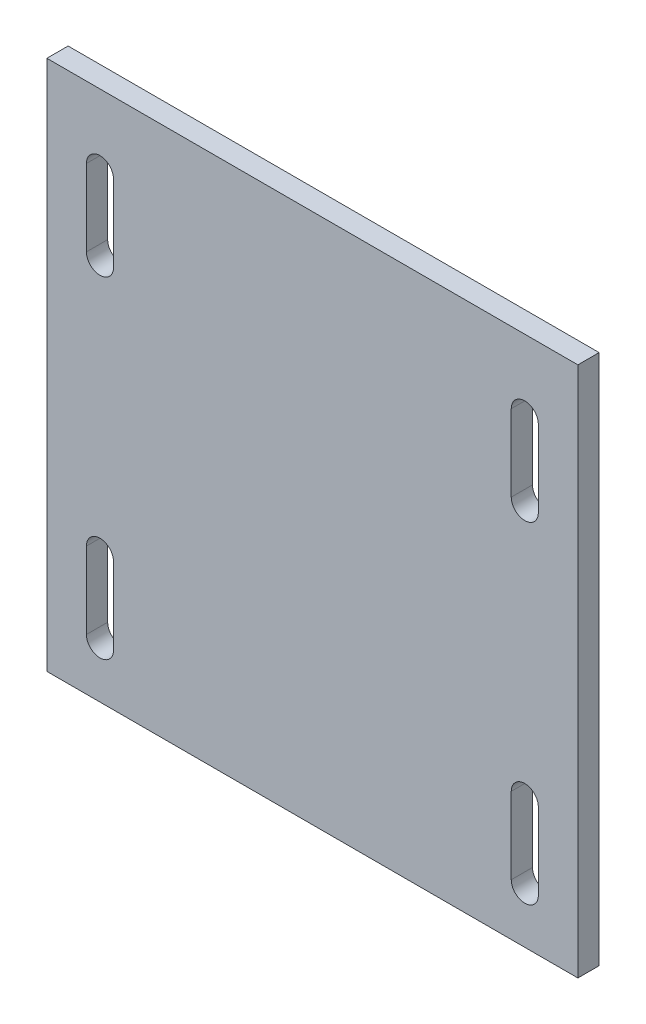
ISO-10303-21;
HEADER;
FILE_DESCRIPTION(('STEP AP214'),'2;1');
FILE_NAME('part.step','',(''),(''),'','','');
FILE_SCHEMA(('AUTOMOTIVE_DESIGN { 1 0 10303 214 1 1 1 1 }'));
ENDSEC;
DATA;
#1=APPLICATION_CONTEXT('core data for automotive mechanical design processes');
#2=APPLICATION_PROTOCOL_DEFINITION('international standard','automotive_design',2000,#1);
#3=PRODUCT_CONTEXT('',#1,'mechanical');
#4=PRODUCT('Part','Part','',(#3));
#5=PRODUCT_RELATED_PRODUCT_CATEGORY('part','',(#4));
#6=PRODUCT_DEFINITION_FORMATION('','',#4);
#7=PRODUCT_DEFINITION_CONTEXT('part definition',#1,'design');
#8=PRODUCT_DEFINITION('design','',#6,#7);
#9=PRODUCT_DEFINITION_SHAPE('','',#8);
#10=(LENGTH_UNIT() NAMED_UNIT(*) SI_UNIT(.MILLI.,.METRE.));
#11=(NAMED_UNIT(*) PLANE_ANGLE_UNIT() SI_UNIT($,.RADIAN.));
#12=(NAMED_UNIT(*) SI_UNIT($,.STERADIAN.) SOLID_ANGLE_UNIT());
#13=UNCERTAINTY_MEASURE_WITH_UNIT(LENGTH_MEASURE(1.E-05),#10,'distance_accuracy_value','');
#14=(GEOMETRIC_REPRESENTATION_CONTEXT(3) GLOBAL_UNCERTAINTY_ASSIGNED_CONTEXT((#13)) GLOBAL_UNIT_ASSIGNED_CONTEXT((#10,
#11,#12)) REPRESENTATION_CONTEXT('',''));
#15=CARTESIAN_POINT('',(0.,0.,0.));
#16=DIRECTION('',(0.,0.,1.));
#17=DIRECTION('',(1.,0.,0.));
#18=AXIS2_PLACEMENT_3D('',#15,#16,#17);
#19=CARTESIAN_POINT('',(0.,0.,4.));
#20=DIRECTION('',(0.,0.,1.));
#21=DIRECTION('',(1.,0.,0.));
#22=AXIS2_PLACEMENT_3D('',#19,#20,#21);
#23=PLANE('',#22);
#24=DIRECTION('',(0.,-1.,0.));
#25=VECTOR('',#24,1.);
#26=CARTESIAN_POINT('',(0.,0.,4.));
#27=LINE('',#26,#25);
#28=CARTESIAN_POINT('',(0.,90.,4.));
#29=VERTEX_POINT('',#28);
#30=CARTESIAN_POINT('',(0.,-10.,4.));
#31=VERTEX_POINT('',#30);
#32=EDGE_CURVE('E308',#29,#31,#27,.T.);
#33=ORIENTED_EDGE('',*,*,#32,.T.);
#34=DIRECTION('',(1.,0.,0.));
#35=VECTOR('',#34,1.);
#36=CARTESIAN_POINT('',(0.,-10.,4.));
#37=LINE('',#36,#35);
#38=CARTESIAN_POINT('',(100.,-10.,4.));
#39=VERTEX_POINT('',#38);
#40=EDGE_CURVE('E311',#31,#39,#37,.T.);
#41=ORIENTED_EDGE('',*,*,#40,.T.);
#42=DIRECTION('',(0.,1.,0.));
#43=VECTOR('',#42,1.);
#44=CARTESIAN_POINT('',(100.,-10.,4.));
#45=LINE('',#44,#43);
#46=CARTESIAN_POINT('',(100.,90.,4.));
#47=VERTEX_POINT('',#46);
#48=EDGE_CURVE('E314',#39,#47,#45,.T.);
#49=ORIENTED_EDGE('',*,*,#48,.T.);
#50=DIRECTION('',(-1.,0.,0.));
#51=VECTOR('',#50,1.);
#52=CARTESIAN_POINT('',(0.,90.,4.));
#53=LINE('',#52,#51);
#54=EDGE_CURVE('E316',#47,#29,#53,.T.);
#55=ORIENTED_EDGE('',*,*,#54,.T.);
#56=EDGE_LOOP('',(#33,#41,#49,#55));
#57=FACE_BOUND('',#56,.T.);
#58=DIRECTION('',(0.,-1.,0.));
#59=VECTOR('',#58,1.);
#60=CARTESIAN_POINT('',(7.45000000000001,14.1724377602917,4.));
#61=LINE('',#60,#59);
#62=CARTESIAN_POINT('',(7.45000000000001,14.1724377602917,4.));
#63=VERTEX_POINT('',#62);
#64=CARTESIAN_POINT('',(7.45000000000001,-0.250300489708305,4.));
#65=VERTEX_POINT('',#64);
#66=EDGE_CURVE('E279',#63,#65,#61,.T.);
#67=ORIENTED_EDGE('',*,*,#66,.F.);
#68=CARTESIAN_POINT('',(10.,14.1724377602917,4.));
#69=DIRECTION('',(0.,0.,1.));
#70=DIRECTION('',(-1.,0.,0.));
#71=AXIS2_PLACEMENT_3D('',#68,#69,#70);
#72=CIRCLE('',#71,2.55);
#73=CARTESIAN_POINT('',(12.55,14.1724377602917,4.));
#74=VERTEX_POINT('',#73);
#75=EDGE_CURVE('E277',#74,#63,#72,.T.);
#76=ORIENTED_EDGE('',*,*,#75,.F.);
#77=DIRECTION('',(0.,1.,0.));
#78=VECTOR('',#77,1.);
#79=CARTESIAN_POINT('',(12.55,14.1724377602917,4.));
#80=LINE('',#79,#78);
#81=CARTESIAN_POINT('',(12.55,-0.250300489708305,4.));
#82=VERTEX_POINT('',#81);
#83=EDGE_CURVE('E285',#82,#74,#80,.T.);
#84=ORIENTED_EDGE('',*,*,#83,.F.);
#85=CARTESIAN_POINT('',(10.,-0.250300489708305,4.));
#86=DIRECTION('',(0.,0.,1.));
#87=DIRECTION('',(-1.,0.,0.));
#88=AXIS2_PLACEMENT_3D('',#85,#86,#87);
#89=CIRCLE('',#88,2.55);
#90=EDGE_CURVE('E282',#65,#82,#89,.T.);
#91=ORIENTED_EDGE('',*,*,#90,.F.);
#92=EDGE_LOOP('',(#67,#76,#84,#91));
#93=FACE_BOUND('',#92,.T.);
#94=DIRECTION('',(0.,1.,0.));
#95=VECTOR('',#94,1.);
#96=CARTESIAN_POINT('',(12.55,62.1505714186554,4.));
#97=LINE('',#96,#95);
#98=CARTESIAN_POINT('',(12.55,62.1505714186554,4.));
#99=VERTEX_POINT('',#98);
#100=CARTESIAN_POINT('',(12.55,76.5733096702234,4.));
#101=VERTEX_POINT('',#100);
#102=EDGE_CURVE('E248',#99,#101,#97,.T.);
#103=ORIENTED_EDGE('',*,*,#102,.F.);
#104=CARTESIAN_POINT('',(10.,62.1505714186554,4.));
#105=DIRECTION('',(0.,0.,1.));
#106=DIRECTION('',(-1.,0.,0.));
#107=AXIS2_PLACEMENT_3D('',#104,#105,#106);
#108=CIRCLE('',#107,2.54999999999998);
#109=CARTESIAN_POINT('',(7.45000000000004,62.1505714186554,4.));
#110=VERTEX_POINT('',#109);
#111=EDGE_CURVE('E246',#110,#99,#108,.T.);
#112=ORIENTED_EDGE('',*,*,#111,.F.);
#113=DIRECTION('',(0.,-1.,0.));
#114=VECTOR('',#113,1.);
#115=CARTESIAN_POINT('',(7.45000000000004,62.1505714186554,4.));
#116=LINE('',#115,#114);
#117=CARTESIAN_POINT('',(7.45,76.5733096702234,4.));
#118=VERTEX_POINT('',#117);
#119=EDGE_CURVE('E254',#118,#110,#116,.T.);
#120=ORIENTED_EDGE('',*,*,#119,.F.);
#121=CARTESIAN_POINT('',(10.,76.5733096702234,4.));
#122=DIRECTION('',(0.,0.,1.));
#123=DIRECTION('',(-1.,0.,0.));
#124=AXIS2_PLACEMENT_3D('',#121,#122,#123);
#125=CIRCLE('',#124,2.55000000000001);
#126=EDGE_CURVE('E251',#101,#118,#125,.T.);
#127=ORIENTED_EDGE('',*,*,#126,.F.);
#128=EDGE_LOOP('',(#103,#112,#120,#127));
#129=FACE_BOUND('',#128,.T.);
#130=DIRECTION('',(0.,-1.,0.));
#131=VECTOR('',#130,1.);
#132=CARTESIAN_POINT('',(87.45,14.1724377602917,4.));
#133=LINE('',#132,#131);
#134=CARTESIAN_POINT('',(87.45,14.1724377602917,4.));
#135=VERTEX_POINT('',#134);
#136=CARTESIAN_POINT('',(87.45,-0.250300489708333,4.));
#137=VERTEX_POINT('',#136);
#138=EDGE_CURVE('E217',#135,#137,#133,.T.);
#139=ORIENTED_EDGE('',*,*,#138,.F.);
#140=CARTESIAN_POINT('',(90.,14.1724377602917,4.));
#141=DIRECTION('',(0.,0.,1.));
#142=DIRECTION('',(1.,0.,0.));
#143=AXIS2_PLACEMENT_3D('',#140,#141,#142);
#144=CIRCLE('',#143,2.55);
#145=CARTESIAN_POINT('',(92.55,14.1724377602917,4.));
#146=VERTEX_POINT('',#145);
#147=EDGE_CURVE('E215',#146,#135,#144,.T.);
#148=ORIENTED_EDGE('',*,*,#147,.F.);
#149=DIRECTION('',(0.,1.,0.));
#150=VECTOR('',#149,1.);
#151=CARTESIAN_POINT('',(92.55,14.1724377602917,4.));
#152=LINE('',#151,#150);
#153=CARTESIAN_POINT('',(92.55,-0.250300489708333,4.));
#154=VERTEX_POINT('',#153);
#155=EDGE_CURVE('E223',#154,#146,#152,.T.);
#156=ORIENTED_EDGE('',*,*,#155,.F.);
#157=CARTESIAN_POINT('',(90.,-0.250300489708333,4.));
#158=DIRECTION('',(0.,0.,1.));
#159=DIRECTION('',(1.,0.,0.));
#160=AXIS2_PLACEMENT_3D('',#157,#158,#159);
#161=CIRCLE('',#160,2.55);
#162=EDGE_CURVE('E220',#137,#154,#161,.T.);
#163=ORIENTED_EDGE('',*,*,#162,.F.);
#164=EDGE_LOOP('',(#139,#148,#156,#163));
#165=FACE_BOUND('',#164,.T.);
#166=DIRECTION('',(0.,1.,0.));
#167=VECTOR('',#166,1.);
#168=CARTESIAN_POINT('',(92.55,62.1505714186554,4.));
#169=LINE('',#168,#167);
#170=CARTESIAN_POINT('',(92.55,62.1505714186554,4.));
#171=VERTEX_POINT('',#170);
#172=CARTESIAN_POINT('',(92.55,76.5733096702235,4.));
#173=VERTEX_POINT('',#172);
#174=EDGE_CURVE('E187',#171,#173,#169,.T.);
#175=ORIENTED_EDGE('',*,*,#174,.F.);
#176=CARTESIAN_POINT('',(90.,62.1505714186554,4.));
#177=DIRECTION('',(0.,0.,1.));
#178=DIRECTION('',(1.,0.,0.));
#179=AXIS2_PLACEMENT_3D('',#176,#177,#178);
#180=CIRCLE('',#179,2.54999999999998);
#181=CARTESIAN_POINT('',(87.45,62.1505714186554,4.));
#182=VERTEX_POINT('',#181);
#183=EDGE_CURVE('E179',#182,#171,#180,.T.);
#184=ORIENTED_EDGE('',*,*,#183,.F.);
#185=DIRECTION('',(0.,-1.,0.));
#186=VECTOR('',#185,1.);
#187=CARTESIAN_POINT('',(87.45,62.1505714186554,4.));
#188=LINE('',#187,#186);
#189=CARTESIAN_POINT('',(87.45,76.5733096702235,4.));
#190=VERTEX_POINT('',#189);
#191=EDGE_CURVE('E201',#190,#182,#188,.T.);
#192=ORIENTED_EDGE('',*,*,#191,.F.);
#193=CARTESIAN_POINT('',(90.,76.5733096702235,4.));
#194=DIRECTION('',(0.,0.,1.));
#195=DIRECTION('',(1.,0.,0.));
#196=AXIS2_PLACEMENT_3D('',#193,#194,#195);
#197=CIRCLE('',#196,2.55000000000001);
#198=EDGE_CURVE('E199',#173,#190,#197,.T.);
#199=ORIENTED_EDGE('',*,*,#198,.F.);
#200=EDGE_LOOP('',(#175,#184,#192,#199));
#201=FACE_BOUND('',#200,.T.);
#202=ADVANCED_FACE('F42',(#57,#93,#129,#165,#201),#23,.T.);
#203=CARTESIAN_POINT('',(0.,0.,0.));
#204=DIRECTION('',(0.,0.,1.));
#205=DIRECTION('',(1.,0.,0.));
#206=AXIS2_PLACEMENT_3D('',#203,#204,#205);
#207=PLANE('',#206);
#208=CARTESIAN_POINT('',(90.,14.1724377602917,0.));
#209=DIRECTION('',(0.,0.,1.));
#210=DIRECTION('',(1.,0.,0.));
#211=AXIS2_PLACEMENT_3D('',#208,#209,#210);
#212=CIRCLE('',#211,2.55);
#213=CARTESIAN_POINT('',(92.55,14.1724377602917,0.));
#214=VERTEX_POINT('',#213);
#215=CARTESIAN_POINT('',(87.45,14.1724377602917,0.));
#216=VERTEX_POINT('',#215);
#217=EDGE_CURVE('E195',#214,#216,#212,.T.);
#218=ORIENTED_EDGE('',*,*,#217,.T.);
#219=DIRECTION('',(0.,-1.,0.));
#220=VECTOR('',#219,1.);
#221=CARTESIAN_POINT('',(87.45,14.1724377602917,0.));
#222=LINE('',#221,#220);
#223=CARTESIAN_POINT('',(87.45,-0.250300489708333,0.));
#224=VERTEX_POINT('',#223);
#225=EDGE_CURVE('E228',#216,#224,#222,.T.);
#226=ORIENTED_EDGE('',*,*,#225,.T.);
#227=CARTESIAN_POINT('',(90.,-0.250300489708333,0.));
#228=DIRECTION('',(0.,0.,1.));
#229=DIRECTION('',(1.,0.,0.));
#230=AXIS2_PLACEMENT_3D('',#227,#228,#229);
#231=CIRCLE('',#230,2.55);
#232=CARTESIAN_POINT('',(92.55,-0.250300489708333,0.));
#233=VERTEX_POINT('',#232);
#234=EDGE_CURVE('E231',#224,#233,#231,.T.);
#235=ORIENTED_EDGE('',*,*,#234,.T.);
#236=DIRECTION('',(0.,1.,0.));
#237=VECTOR('',#236,1.);
#238=CARTESIAN_POINT('',(92.55,14.1724377602917,0.));
#239=LINE('',#238,#237);
#240=EDGE_CURVE('E218',#233,#214,#239,.T.);
#241=ORIENTED_EDGE('',*,*,#240,.T.);
#242=EDGE_LOOP('',(#218,#226,#235,#241));
#243=FACE_BOUND('',#242,.T.);
#244=CARTESIAN_POINT('',(10.,14.1724377602917,0.));
#245=DIRECTION('',(0.,0.,1.));
#246=DIRECTION('',(-1.,0.,0.));
#247=AXIS2_PLACEMENT_3D('',#244,#245,#246);
#248=CIRCLE('',#247,2.55);
#249=CARTESIAN_POINT('',(12.55,14.1724377602917,0.));
#250=VERTEX_POINT('',#249);
#251=CARTESIAN_POINT('',(7.45000000000001,14.1724377602917,0.));
#252=VERTEX_POINT('',#251);
#253=EDGE_CURVE('E276',#250,#252,#248,.T.);
#254=ORIENTED_EDGE('',*,*,#253,.T.);
#255=DIRECTION('',(0.,-1.,0.));
#256=VECTOR('',#255,1.);
#257=CARTESIAN_POINT('',(7.45000000000001,14.1724377602917,0.));
#258=LINE('',#257,#256);
#259=CARTESIAN_POINT('',(7.45000000000001,-0.250300489708305,0.));
#260=VERTEX_POINT('',#259);
#261=EDGE_CURVE('E290',#252,#260,#258,.T.);
#262=ORIENTED_EDGE('',*,*,#261,.T.);
#263=CARTESIAN_POINT('',(10.,-0.250300489708305,0.));
#264=DIRECTION('',(0.,0.,1.));
#265=DIRECTION('',(-1.,0.,0.));
#266=AXIS2_PLACEMENT_3D('',#263,#264,#265);
#267=CIRCLE('',#266,2.55);
#268=CARTESIAN_POINT('',(12.55,-0.250300489708305,0.));
#269=VERTEX_POINT('',#268);
#270=EDGE_CURVE('E293',#260,#269,#267,.T.);
#271=ORIENTED_EDGE('',*,*,#270,.T.);
#272=DIRECTION('',(0.,1.,0.));
#273=VECTOR('',#272,1.);
#274=CARTESIAN_POINT('',(12.55,14.1724377602917,0.));
#275=LINE('',#274,#273);
#276=EDGE_CURVE('E280',#269,#250,#275,.T.);
#277=ORIENTED_EDGE('',*,*,#276,.T.);
#278=EDGE_LOOP('',(#254,#262,#271,#277));
#279=FACE_BOUND('',#278,.T.);
#280=DIRECTION('',(1.,0.,0.));
#281=VECTOR('',#280,1.);
#282=CARTESIAN_POINT('',(0.,-10.,0.));
#283=LINE('',#282,#281);
#284=CARTESIAN_POINT('',(0.,-10.,0.));
#285=VERTEX_POINT('',#284);
#286=CARTESIAN_POINT('',(100.,-10.,0.));
#287=VERTEX_POINT('',#286);
#288=EDGE_CURVE('E307',#285,#287,#283,.T.);
#289=ORIENTED_EDGE('',*,*,#288,.F.);
#290=DIRECTION('',(0.,-1.,0.));
#291=VECTOR('',#290,1.);
#292=CARTESIAN_POINT('',(0.,0.,0.));
#293=LINE('',#292,#291);
#294=CARTESIAN_POINT('',(0.,90.,0.));
#295=VERTEX_POINT('',#294);
#296=EDGE_CURVE('E312',#295,#285,#293,.T.);
#297=ORIENTED_EDGE('',*,*,#296,.F.);
#298=DIRECTION('',(-1.,0.,0.));
#299=VECTOR('',#298,1.);
#300=CARTESIAN_POINT('',(0.,90.,0.));
#301=LINE('',#300,#299);
#302=CARTESIAN_POINT('',(100.,90.,0.));
#303=VERTEX_POINT('',#302);
#304=EDGE_CURVE('E324',#303,#295,#301,.T.);
#305=ORIENTED_EDGE('',*,*,#304,.F.);
#306=DIRECTION('',(0.,1.,0.));
#307=VECTOR('',#306,1.);
#308=CARTESIAN_POINT('',(100.,2.37229593660626,0.));
#309=LINE('',#308,#307);
#310=EDGE_CURVE('E322',#287,#303,#309,.T.);
#311=ORIENTED_EDGE('',*,*,#310,.F.);
#312=EDGE_LOOP('',(#289,#297,#305,#311));
#313=FACE_BOUND('',#312,.T.);
#314=CARTESIAN_POINT('',(10.,62.1505714186554,0.));
#315=DIRECTION('',(0.,0.,1.));
#316=DIRECTION('',(-1.,0.,0.));
#317=AXIS2_PLACEMENT_3D('',#314,#315,#316);
#318=CIRCLE('',#317,2.54999999999998);
#319=CARTESIAN_POINT('',(7.45000000000004,62.1505714186554,0.));
#320=VERTEX_POINT('',#319);
#321=CARTESIAN_POINT('',(12.55,62.1505714186554,0.));
#322=VERTEX_POINT('',#321);
#323=EDGE_CURVE('E245',#320,#322,#318,.T.);
#324=ORIENTED_EDGE('',*,*,#323,.T.);
#325=DIRECTION('',(0.,1.,0.));
#326=VECTOR('',#325,1.);
#327=CARTESIAN_POINT('',(12.55,62.1505714186554,0.));
#328=LINE('',#327,#326);
#329=CARTESIAN_POINT('',(12.55,76.5733096702234,0.));
#330=VERTEX_POINT('',#329);
#331=EDGE_CURVE('E259',#322,#330,#328,.T.);
#332=ORIENTED_EDGE('',*,*,#331,.T.);
#333=CARTESIAN_POINT('',(10.,76.5733096702234,0.));
#334=DIRECTION('',(0.,0.,1.));
#335=DIRECTION('',(-1.,0.,0.));
#336=AXIS2_PLACEMENT_3D('',#333,#334,#335);
#337=CIRCLE('',#336,2.55000000000001);
#338=CARTESIAN_POINT('',(7.45000000000001,76.5733096702234,0.));
#339=VERTEX_POINT('',#338);
#340=EDGE_CURVE('E262',#330,#339,#337,.T.);
#341=ORIENTED_EDGE('',*,*,#340,.T.);
#342=DIRECTION('',(0.,-1.,0.));
#343=VECTOR('',#342,1.);
#344=CARTESIAN_POINT('',(7.45000000000004,62.1505714186554,0.));
#345=LINE('',#344,#343);
#346=EDGE_CURVE('E249',#339,#320,#345,.T.);
#347=ORIENTED_EDGE('',*,*,#346,.T.);
#348=EDGE_LOOP('',(#324,#332,#341,#347));
#349=FACE_BOUND('',#348,.T.);
#350=CARTESIAN_POINT('',(90.,62.1505714186554,0.));
#351=DIRECTION('',(0.,0.,1.));
#352=DIRECTION('',(1.,0.,0.));
#353=AXIS2_PLACEMENT_3D('',#350,#351,#352);
#354=CIRCLE('',#353,2.54999999999998);
#355=CARTESIAN_POINT('',(87.45,62.1505714186554,0.));
#356=VERTEX_POINT('',#355);
#357=CARTESIAN_POINT('',(92.55,62.1505714186554,0.));
#358=VERTEX_POINT('',#357);
#359=EDGE_CURVE('E65',#356,#358,#354,.T.);
#360=ORIENTED_EDGE('',*,*,#359,.T.);
#361=DIRECTION('',(0.,1.,0.));
#362=VECTOR('',#361,1.);
#363=CARTESIAN_POINT('',(92.55,62.1505714186554,0.));
#364=LINE('',#363,#362);
#365=CARTESIAN_POINT('',(92.55,76.5733096702235,0.));
#366=VERTEX_POINT('',#365);
#367=EDGE_CURVE('E194',#358,#366,#364,.T.);
#368=ORIENTED_EDGE('',*,*,#367,.T.);
#369=CARTESIAN_POINT('',(90.,76.5733096702235,0.));
#370=DIRECTION('',(0.,0.,1.));
#371=DIRECTION('',(1.,0.,0.));
#372=AXIS2_PLACEMENT_3D('',#369,#370,#371);
#373=CIRCLE('',#372,2.55000000000001);
#374=CARTESIAN_POINT('',(87.45,76.5733096702235,0.));
#375=VERTEX_POINT('',#374);
#376=EDGE_CURVE('E207',#366,#375,#373,.T.);
#377=ORIENTED_EDGE('',*,*,#376,.T.);
#378=DIRECTION('',(0.,-1.,0.));
#379=VECTOR('',#378,1.);
#380=CARTESIAN_POINT('',(87.45,62.1505714186554,0.));
#381=LINE('',#380,#379);
#382=EDGE_CURVE('E188',#375,#356,#381,.T.);
#383=ORIENTED_EDGE('',*,*,#382,.T.);
#384=EDGE_LOOP('',(#360,#368,#377,#383));
#385=FACE_BOUND('',#384,.T.);
#386=ADVANCED_FACE('F342',(#243,#279,#313,#349,#385),#207,.F.);
#387=CARTESIAN_POINT('',(0.,-10.,4.));
#388=DIRECTION('',(0.,1.,0.));
#389=DIRECTION('',(0.,0.,1.));
#390=AXIS2_PLACEMENT_3D('',#387,#388,#389);
#391=PLANE('',#390);
#392=ORIENTED_EDGE('',*,*,#288,.T.);
#393=DIRECTION('',(0.,0.,-1.));
#394=VECTOR('',#393,1.);
#395=CARTESIAN_POINT('',(100.,-10.,4.));
#396=LINE('',#395,#394);
#397=EDGE_CURVE('E50',#39,#287,#396,.T.);
#398=ORIENTED_EDGE('',*,*,#397,.F.);
#399=ORIENTED_EDGE('',*,*,#40,.F.);
#400=DIRECTION('',(0.,0.,-1.));
#401=VECTOR('',#400,1.);
#402=CARTESIAN_POINT('',(0.,-10.,4.));
#403=LINE('',#402,#401);
#404=EDGE_CURVE('E11',#31,#285,#403,.T.);
#405=ORIENTED_EDGE('',*,*,#404,.T.);
#406=EDGE_LOOP('',(#392,#398,#399,#405));
#407=FACE_BOUND('',#406,.T.);
#408=ADVANCED_FACE('F44',(#407),#391,.F.);
#409=CARTESIAN_POINT('',(100.,2.37229593660626,4.));
#410=DIRECTION('',(-1.,0.,0.));
#411=DIRECTION('',(0.,0.,1.));
#412=AXIS2_PLACEMENT_3D('',#409,#410,#411);
#413=PLANE('',#412);
#414=ORIENTED_EDGE('',*,*,#310,.T.);
#415=DIRECTION('',(0.,0.,-1.));
#416=VECTOR('',#415,1.);
#417=CARTESIAN_POINT('',(100.,90.,4.));
#418=LINE('',#417,#416);
#419=EDGE_CURVE('E329',#47,#303,#418,.T.);
#420=ORIENTED_EDGE('',*,*,#419,.F.);
#421=ORIENTED_EDGE('',*,*,#48,.F.);
#422=ORIENTED_EDGE('',*,*,#397,.T.);
#423=EDGE_LOOP('',(#414,#420,#421,#422));
#424=FACE_BOUND('',#423,.T.);
#425=ADVANCED_FACE('F335',(#424),#413,.F.);
#426=CARTESIAN_POINT('',(0.,90.,4.));
#427=DIRECTION('',(0.,-1.,0.));
#428=DIRECTION('',(1.,0.,0.));
#429=AXIS2_PLACEMENT_3D('',#426,#427,#428);
#430=PLANE('',#429);
#431=ORIENTED_EDGE('',*,*,#304,.T.);
#432=DIRECTION('',(0.,0.,-1.));
#433=VECTOR('',#432,1.);
#434=CARTESIAN_POINT('',(0.,90.,4.));
#435=LINE('',#434,#433);
#436=EDGE_CURVE('E319',#29,#295,#435,.T.);
#437=ORIENTED_EDGE('',*,*,#436,.F.);
#438=ORIENTED_EDGE('',*,*,#54,.F.);
#439=ORIENTED_EDGE('',*,*,#419,.T.);
#440=EDGE_LOOP('',(#431,#437,#438,#439));
#441=FACE_BOUND('',#440,.T.);
#442=ADVANCED_FACE('F347',(#441),#430,.F.);
#443=CARTESIAN_POINT('',(0.,0.,4.));
#444=DIRECTION('',(1.,0.,0.));
#445=DIRECTION('',(0.,0.,-1.));
#446=AXIS2_PLACEMENT_3D('',#443,#444,#445);
#447=PLANE('',#446);
#448=ORIENTED_EDGE('',*,*,#296,.T.);
#449=ORIENTED_EDGE('',*,*,#404,.F.);
#450=ORIENTED_EDGE('',*,*,#32,.F.);
#451=ORIENTED_EDGE('',*,*,#436,.T.);
#452=EDGE_LOOP('',(#448,#449,#450,#451));
#453=FACE_BOUND('',#452,.T.);
#454=ADVANCED_FACE('F350',(#453),#447,.F.);
#455=CARTESIAN_POINT('',(10.,14.1724377602917,4.));
#456=DIRECTION('',(0.,0.,-1.));
#457=DIRECTION('',(-1.,0.,0.));
#458=AXIS2_PLACEMENT_3D('',#455,#456,#457);
#459=CYLINDRICAL_SURFACE('',#458,2.55);
#460=ORIENTED_EDGE('',*,*,#253,.F.);
#461=DIRECTION('',(0.,0.,-1.));
#462=VECTOR('',#461,1.);
#463=CARTESIAN_POINT('',(12.55,14.1724377602917,4.));
#464=LINE('',#463,#462);
#465=EDGE_CURVE('E287',#74,#250,#464,.T.);
#466=ORIENTED_EDGE('',*,*,#465,.F.);
#467=ORIENTED_EDGE('',*,*,#75,.T.);
#468=DIRECTION('',(0.,0.,-1.));
#469=VECTOR('',#468,1.);
#470=CARTESIAN_POINT('',(7.45000000000001,14.1724377602917,4.));
#471=LINE('',#470,#469);
#472=EDGE_CURVE('E304',#63,#252,#471,.T.);
#473=ORIENTED_EDGE('',*,*,#472,.T.);
#474=EDGE_LOOP('',(#460,#466,#467,#473));
#475=FACE_BOUND('',#474,.T.);
#476=ADVANCED_FACE('F423',(#475),#459,.F.);
#477=CARTESIAN_POINT('',(7.45000000000001,14.1724377602917,4.));
#478=DIRECTION('',(1.,0.,0.));
#479=DIRECTION('',(0.,0.,-1.));
#480=AXIS2_PLACEMENT_3D('',#477,#478,#479);
#481=PLANE('',#480);
#482=ORIENTED_EDGE('',*,*,#261,.F.);
#483=ORIENTED_EDGE('',*,*,#472,.F.);
#484=ORIENTED_EDGE('',*,*,#66,.T.);
#485=DIRECTION('',(0.,0.,-1.));
#486=VECTOR('',#485,1.);
#487=CARTESIAN_POINT('',(7.45000000000001,-0.250300489708305,4.));
#488=LINE('',#487,#486);
#489=EDGE_CURVE('E302',#65,#260,#488,.T.);
#490=ORIENTED_EDGE('',*,*,#489,.T.);
#491=EDGE_LOOP('',(#482,#483,#484,#490));
#492=FACE_BOUND('',#491,.T.);
#493=ADVANCED_FACE('F419',(#492),#481,.T.);
#494=CARTESIAN_POINT('',(10.,-0.250300489708305,4.));
#495=DIRECTION('',(0.,0.,-1.));
#496=DIRECTION('',(-1.,0.,0.));
#497=AXIS2_PLACEMENT_3D('',#494,#495,#496);
#498=CYLINDRICAL_SURFACE('',#497,2.55);
#499=ORIENTED_EDGE('',*,*,#270,.F.);
#500=ORIENTED_EDGE('',*,*,#489,.F.);
#501=ORIENTED_EDGE('',*,*,#90,.T.);
#502=DIRECTION('',(0.,0.,-1.));
#503=VECTOR('',#502,1.);
#504=CARTESIAN_POINT('',(12.55,-0.250300489708305,4.));
#505=LINE('',#504,#503);
#506=EDGE_CURVE('E300',#82,#269,#505,.T.);
#507=ORIENTED_EDGE('',*,*,#506,.T.);
#508=EDGE_LOOP('',(#499,#500,#501,#507));
#509=FACE_BOUND('',#508,.T.);
#510=ADVANCED_FACE('F415',(#509),#498,.F.);
#511=CARTESIAN_POINT('',(12.55,14.1724377602917,4.));
#512=DIRECTION('',(-1.,0.,0.));
#513=DIRECTION('',(0.,0.,1.));
#514=AXIS2_PLACEMENT_3D('',#511,#512,#513);
#515=PLANE('',#514);
#516=ORIENTED_EDGE('',*,*,#276,.F.);
#517=ORIENTED_EDGE('',*,*,#506,.F.);
#518=ORIENTED_EDGE('',*,*,#83,.T.);
#519=ORIENTED_EDGE('',*,*,#465,.T.);
#520=EDGE_LOOP('',(#516,#517,#518,#519));
#521=FACE_BOUND('',#520,.T.);
#522=ADVANCED_FACE('F411',(#521),#515,.T.);
#523=CARTESIAN_POINT('',(10.,62.1505714186554,4.));
#524=DIRECTION('',(0.,0.,-1.));
#525=DIRECTION('',(-1.,0.,0.));
#526=AXIS2_PLACEMENT_3D('',#523,#524,#525);
#527=CYLINDRICAL_SURFACE('',#526,2.54999999999998);
#528=ORIENTED_EDGE('',*,*,#323,.F.);
#529=DIRECTION('',(0.,0.,-1.));
#530=VECTOR('',#529,1.);
#531=CARTESIAN_POINT('',(7.45000000000004,62.1505714186554,4.));
#532=LINE('',#531,#530);
#533=EDGE_CURVE('E256',#110,#320,#532,.T.);
#534=ORIENTED_EDGE('',*,*,#533,.F.);
#535=ORIENTED_EDGE('',*,*,#111,.T.);
#536=DIRECTION('',(0.,0.,-1.));
#537=VECTOR('',#536,1.);
#538=CARTESIAN_POINT('',(12.55,62.1505714186554,4.));
#539=LINE('',#538,#537);
#540=EDGE_CURVE('E273',#99,#322,#539,.T.);
#541=ORIENTED_EDGE('',*,*,#540,.T.);
#542=EDGE_LOOP('',(#528,#534,#535,#541));
#543=FACE_BOUND('',#542,.T.);
#544=ADVANCED_FACE('F407',(#543),#527,.F.);
#545=CARTESIAN_POINT('',(12.55,62.1505714186554,4.));
#546=DIRECTION('',(-1.,0.,0.));
#547=DIRECTION('',(0.,-1.,0.));
#548=AXIS2_PLACEMENT_3D('',#545,#546,#547);
#549=PLANE('',#548);
#550=ORIENTED_EDGE('',*,*,#331,.F.);
#551=ORIENTED_EDGE('',*,*,#540,.F.);
#552=ORIENTED_EDGE('',*,*,#102,.T.);
#553=DIRECTION('',(0.,0.,-1.));
#554=VECTOR('',#553,1.);
#555=CARTESIAN_POINT('',(12.55,76.5733096702234,4.));
#556=LINE('',#555,#554);
#557=EDGE_CURVE('E271',#101,#330,#556,.T.);
#558=ORIENTED_EDGE('',*,*,#557,.T.);
#559=EDGE_LOOP('',(#550,#551,#552,#558));
#560=FACE_BOUND('',#559,.T.);
#561=ADVANCED_FACE('F403',(#560),#549,.T.);
#562=CARTESIAN_POINT('',(10.,76.5733096702234,4.));
#563=DIRECTION('',(0.,0.,-1.));
#564=DIRECTION('',(-1.,0.,0.));
#565=AXIS2_PLACEMENT_3D('',#562,#563,#564);
#566=CYLINDRICAL_SURFACE('',#565,2.55000000000001);
#567=ORIENTED_EDGE('',*,*,#340,.F.);
#568=ORIENTED_EDGE('',*,*,#557,.F.);
#569=ORIENTED_EDGE('',*,*,#126,.T.);
#570=DIRECTION('',(0.,0.,-1.));
#571=VECTOR('',#570,1.);
#572=CARTESIAN_POINT('',(7.45000000000001,76.5733096702234,4.));
#573=LINE('',#572,#571);
#574=EDGE_CURVE('E269',#118,#339,#573,.T.);
#575=ORIENTED_EDGE('',*,*,#574,.T.);
#576=EDGE_LOOP('',(#567,#568,#569,#575));
#577=FACE_BOUND('',#576,.T.);
#578=ADVANCED_FACE('F399',(#577),#566,.F.);
#579=CARTESIAN_POINT('',(7.45000000000004,62.1505714186554,4.));
#580=DIRECTION('',(1.,0.,0.));
#581=DIRECTION('',(0.,1.,0.));
#582=AXIS2_PLACEMENT_3D('',#579,#580,#581);
#583=PLANE('',#582);
#584=ORIENTED_EDGE('',*,*,#346,.F.);
#585=ORIENTED_EDGE('',*,*,#574,.F.);
#586=ORIENTED_EDGE('',*,*,#119,.T.);
#587=ORIENTED_EDGE('',*,*,#533,.T.);
#588=EDGE_LOOP('',(#584,#585,#586,#587));
#589=FACE_BOUND('',#588,.T.);
#590=ADVANCED_FACE('F396',(#589),#583,.T.);
#591=CARTESIAN_POINT('',(90.,14.1724377602917,4.));
#592=DIRECTION('',(0.,0.,-1.));
#593=DIRECTION('',(-1.,0.,0.));
#594=AXIS2_PLACEMENT_3D('',#591,#592,#593);
#595=CYLINDRICAL_SURFACE('',#594,2.55);
#596=ORIENTED_EDGE('',*,*,#217,.F.);
#597=DIRECTION('',(0.,0.,-1.));
#598=VECTOR('',#597,1.);
#599=CARTESIAN_POINT('',(92.55,14.1724377602917,4.));
#600=LINE('',#599,#598);
#601=EDGE_CURVE('E225',#146,#214,#600,.T.);
#602=ORIENTED_EDGE('',*,*,#601,.F.);
#603=ORIENTED_EDGE('',*,*,#147,.T.);
#604=DIRECTION('',(0.,0.,-1.));
#605=VECTOR('',#604,1.);
#606=CARTESIAN_POINT('',(87.45,14.1724377602917,4.));
#607=LINE('',#606,#605);
#608=EDGE_CURVE('E242',#135,#216,#607,.T.);
#609=ORIENTED_EDGE('',*,*,#608,.T.);
#610=EDGE_LOOP('',(#596,#602,#603,#609));
#611=FACE_BOUND('',#610,.T.);
#612=ADVANCED_FACE('F378',(#611),#595,.F.);
#613=CARTESIAN_POINT('',(87.45,14.1724377602917,4.));
#614=DIRECTION('',(1.,0.,0.));
#615=DIRECTION('',(0.,0.,-1.));
#616=AXIS2_PLACEMENT_3D('',#613,#614,#615);
#617=PLANE('',#616);
#618=ORIENTED_EDGE('',*,*,#225,.F.);
#619=ORIENTED_EDGE('',*,*,#608,.F.);
#620=ORIENTED_EDGE('',*,*,#138,.T.);
#621=DIRECTION('',(0.,0.,-1.));
#622=VECTOR('',#621,1.);
#623=CARTESIAN_POINT('',(87.45,-0.250300489708333,4.));
#624=LINE('',#623,#622);
#625=EDGE_CURVE('E240',#137,#224,#624,.T.);
#626=ORIENTED_EDGE('',*,*,#625,.T.);
#627=EDGE_LOOP('',(#618,#619,#620,#626));
#628=FACE_BOUND('',#627,.T.);
#629=ADVANCED_FACE('F370',(#628),#617,.T.);
#630=CARTESIAN_POINT('',(90.,-0.250300489708333,4.));
#631=DIRECTION('',(0.,0.,-1.));
#632=DIRECTION('',(-1.,0.,0.));
#633=AXIS2_PLACEMENT_3D('',#630,#631,#632);
#634=CYLINDRICAL_SURFACE('',#633,2.55);
#635=ORIENTED_EDGE('',*,*,#234,.F.);
#636=ORIENTED_EDGE('',*,*,#625,.F.);
#637=ORIENTED_EDGE('',*,*,#162,.T.);
#638=DIRECTION('',(0.,0.,-1.));
#639=VECTOR('',#638,1.);
#640=CARTESIAN_POINT('',(92.55,-0.250300489708333,4.));
#641=LINE('',#640,#639);
#642=EDGE_CURVE('E238',#154,#233,#641,.T.);
#643=ORIENTED_EDGE('',*,*,#642,.T.);
#644=EDGE_LOOP('',(#635,#636,#637,#643));
#645=FACE_BOUND('',#644,.T.);
#646=ADVANCED_FACE('F373',(#645),#634,.F.);
#647=CARTESIAN_POINT('',(92.55,14.1724377602917,4.));
#648=DIRECTION('',(-1.,0.,0.));
#649=DIRECTION('',(0.,0.,1.));
#650=AXIS2_PLACEMENT_3D('',#647,#648,#649);
#651=PLANE('',#650);
#652=ORIENTED_EDGE('',*,*,#240,.F.);
#653=ORIENTED_EDGE('',*,*,#642,.F.);
#654=ORIENTED_EDGE('',*,*,#155,.T.);
#655=ORIENTED_EDGE('',*,*,#601,.T.);
#656=EDGE_LOOP('',(#652,#653,#654,#655));
#657=FACE_BOUND('',#656,.T.);
#658=ADVANCED_FACE('F381',(#657),#651,.T.);
#659=CARTESIAN_POINT('',(90.,62.1505714186554,4.));
#660=DIRECTION('',(0.,0.,-1.));
#661=DIRECTION('',(-1.,0.,0.));
#662=AXIS2_PLACEMENT_3D('',#659,#660,#661);
#663=CYLINDRICAL_SURFACE('',#662,2.54999999999998);
#664=ORIENTED_EDGE('',*,*,#359,.F.);
#665=DIRECTION('',(0.,0.,-1.));
#666=VECTOR('',#665,1.);
#667=CARTESIAN_POINT('',(87.45,62.1505714186554,4.));
#668=LINE('',#667,#666);
#669=EDGE_CURVE('E183',#182,#356,#668,.T.);
#670=ORIENTED_EDGE('',*,*,#669,.F.);
#671=ORIENTED_EDGE('',*,*,#183,.T.);
#672=DIRECTION('',(0.,0.,-1.));
#673=VECTOR('',#672,1.);
#674=CARTESIAN_POINT('',(92.55,62.1505714186554,4.));
#675=LINE('',#674,#673);
#676=EDGE_CURVE('E182',#171,#358,#675,.T.);
#677=ORIENTED_EDGE('',*,*,#676,.T.);
#678=EDGE_LOOP('',(#664,#670,#671,#677));
#679=FACE_BOUND('',#678,.T.);
#680=ADVANCED_FACE('F181',(#679),#663,.F.);
#681=CARTESIAN_POINT('',(92.55,62.1505714186554,4.));
#682=DIRECTION('',(-1.,0.,0.));
#683=DIRECTION('',(0.,-1.,0.));
#684=AXIS2_PLACEMENT_3D('',#681,#682,#683);
#685=PLANE('',#684);
#686=ORIENTED_EDGE('',*,*,#367,.F.);
#687=ORIENTED_EDGE('',*,*,#676,.F.);
#688=ORIENTED_EDGE('',*,*,#174,.T.);
#689=DIRECTION('',(0.,0.,-1.));
#690=VECTOR('',#689,1.);
#691=CARTESIAN_POINT('',(92.55,76.5733096702235,4.));
#692=LINE('',#691,#690);
#693=EDGE_CURVE('E196',#173,#366,#692,.T.);
#694=ORIENTED_EDGE('',*,*,#693,.T.);
#695=EDGE_LOOP('',(#686,#687,#688,#694));
#696=FACE_BOUND('',#695,.T.);
#697=ADVANCED_FACE('F191',(#696),#685,.T.);
#698=CARTESIAN_POINT('',(90.,76.5733096702235,4.));
#699=DIRECTION('',(0.,0.,-1.));
#700=DIRECTION('',(-1.,0.,0.));
#701=AXIS2_PLACEMENT_3D('',#698,#699,#700);
#702=CYLINDRICAL_SURFACE('',#701,2.55000000000001);
#703=ORIENTED_EDGE('',*,*,#376,.F.);
#704=ORIENTED_EDGE('',*,*,#693,.F.);
#705=ORIENTED_EDGE('',*,*,#198,.T.);
#706=DIRECTION('',(0.,0.,-1.));
#707=VECTOR('',#706,1.);
#708=CARTESIAN_POINT('',(87.45,76.5733096702235,4.));
#709=LINE('',#708,#707);
#710=EDGE_CURVE('E57',#190,#375,#709,.T.);
#711=ORIENTED_EDGE('',*,*,#710,.T.);
#712=EDGE_LOOP('',(#703,#704,#705,#711));
#713=FACE_BOUND('',#712,.T.);
#714=ADVANCED_FACE('F540',(#713),#702,.F.);
#715=CARTESIAN_POINT('',(87.45,62.1505714186554,4.));
#716=DIRECTION('',(1.,0.,0.));
#717=DIRECTION('',(0.,1.,0.));
#718=AXIS2_PLACEMENT_3D('',#715,#716,#717);
#719=PLANE('',#718);
#720=ORIENTED_EDGE('',*,*,#382,.F.);
#721=ORIENTED_EDGE('',*,*,#710,.F.);
#722=ORIENTED_EDGE('',*,*,#191,.T.);
#723=ORIENTED_EDGE('',*,*,#669,.T.);
#724=EDGE_LOOP('',(#720,#721,#722,#723));
#725=FACE_BOUND('',#724,.T.);
#726=ADVANCED_FACE('F547',(#725),#719,.T.);
#727=CLOSED_SHELL('',(#202,#386,#408,#425,#442,#454,#476,#493,#510,#522,#544,#561,#578,#590,
#612,#629,#646,#658,#680,#697,#714,#726));
#728=MANIFOLD_SOLID_BREP('B2',#727);
#729=ADVANCED_BREP_SHAPE_REPRESENTATION('',(#18,#728),#14);
#730=SHAPE_DEFINITION_REPRESENTATION(#9,#729);
ENDSEC;
END-ISO-10303-21;
